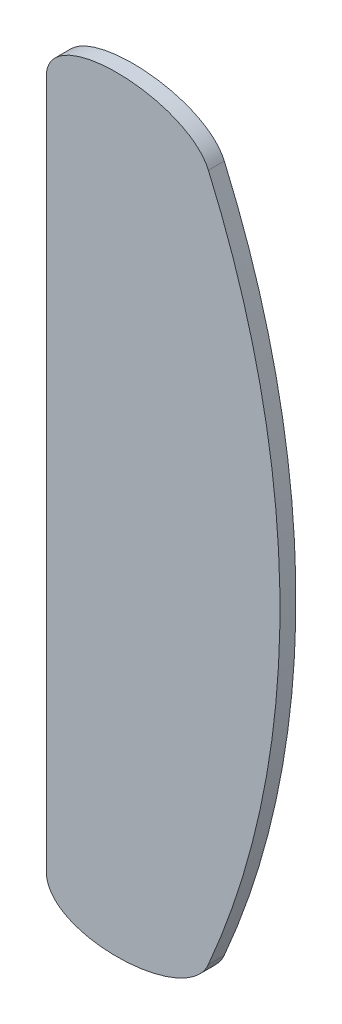
ISO-10303-21;
HEADER;
FILE_DESCRIPTION(('STEP AP214'),'2;1');
FILE_NAME('part.step','',(''),(''),'','','');
FILE_SCHEMA(('AUTOMOTIVE_DESIGN { 1 0 10303 214 1 1 1 1 }'));
ENDSEC;
DATA;
#1=APPLICATION_CONTEXT('core data for automotive mechanical design processes');
#2=APPLICATION_PROTOCOL_DEFINITION('international standard','automotive_design',2000,#1);
#3=PRODUCT_CONTEXT('',#1,'mechanical');
#4=PRODUCT('Part','Part','',(#3));
#5=PRODUCT_RELATED_PRODUCT_CATEGORY('part','',(#4));
#6=PRODUCT_DEFINITION_FORMATION('','',#4);
#7=PRODUCT_DEFINITION_CONTEXT('part definition',#1,'design');
#8=PRODUCT_DEFINITION('design','',#6,#7);
#9=PRODUCT_DEFINITION_SHAPE('','',#8);
#10=(LENGTH_UNIT() NAMED_UNIT(*) SI_UNIT(.MILLI.,.METRE.));
#11=(NAMED_UNIT(*) PLANE_ANGLE_UNIT() SI_UNIT($,.RADIAN.));
#12=(NAMED_UNIT(*) SI_UNIT($,.STERADIAN.) SOLID_ANGLE_UNIT());
#13=UNCERTAINTY_MEASURE_WITH_UNIT(LENGTH_MEASURE(1.E-05),#10,'distance_accuracy_value','');
#14=(GEOMETRIC_REPRESENTATION_CONTEXT(3) GLOBAL_UNCERTAINTY_ASSIGNED_CONTEXT((#13)) GLOBAL_UNIT_ASSIGNED_CONTEXT((#10,
#11,#12)) REPRESENTATION_CONTEXT('',''));
#15=CARTESIAN_POINT('',(0.,0.,0.));
#16=DIRECTION('',(0.,0.,1.));
#17=DIRECTION('',(1.,0.,0.));
#18=AXIS2_PLACEMENT_3D('',#15,#16,#17);
#19=CARTESIAN_POINT('',(3345.33171846151,1933.23089667076,19.05));
#20=CARTESIAN_POINT('',(3345.3317184615,1868.63205542242,19.05));
#21=CARTESIAN_POINT('',(3513.32436618912,1874.00952997675,19.05));
#22=CARTESIAN_POINT('',(3539.12824220654,1933.23089667075,19.05));
#23=B_SPLINE_CURVE_WITH_KNOTS('',3,(#19,#20,#21,#22),.UNSPECIFIED.,.F.,.F.,(4,4),(0.,
7.62978439941085),.UNSPECIFIED.);
#24=DIRECTION('',(0.,0.,-1.));
#25=VECTOR('',#24,1.);
#26=SURFACE_OF_LINEAR_EXTRUSION('',#23,#25);
#27=CARTESIAN_POINT('',(3345.33171846151,1933.23089667076,0.));
#28=CARTESIAN_POINT('',(3345.3317184615,1868.63205542242,0.));
#29=CARTESIAN_POINT('',(3513.32436618912,1874.00952997675,0.));
#30=CARTESIAN_POINT('',(3539.12824220654,1933.23089667075,0.));
#31=B_SPLINE_CURVE_WITH_KNOTS('',3,(#27,#28,#29,#30),.UNSPECIFIED.,.F.,.F.,(4,4),(0.,
7.62978439941085),.UNSPECIFIED.);
#32=CARTESIAN_POINT('',(3345.33171846151,1933.23089667076,0.));
#33=VERTEX_POINT('',#32);
#34=CARTESIAN_POINT('',(3539.12824220654,1933.23089667075,0.));
#35=VERTEX_POINT('',#34);
#36=EDGE_CURVE('E116',#33,#35,#31,.T.);
#37=ORIENTED_EDGE('',*,*,#36,.T.);
#38=DIRECTION('',(0.,0.,-1.));
#39=VECTOR('',#38,1.);
#40=CARTESIAN_POINT('',(3539.12824220654,1933.23089667075,19.05));
#41=LINE('',#40,#39);
#42=CARTESIAN_POINT('',(3539.12824220654,1933.23089667075,19.05));
#43=VERTEX_POINT('',#42);
#44=EDGE_CURVE('E11',#43,#35,#41,.T.);
#45=ORIENTED_EDGE('',*,*,#44,.F.);
#46=CARTESIAN_POINT('',(3345.33171846151,1933.23089667076,19.05));
#47=VERTEX_POINT('',#46);
#48=EDGE_CURVE('E85',#47,#43,#23,.T.);
#49=ORIENTED_EDGE('',*,*,#48,.F.);
#50=DIRECTION('',(0.,0.,-1.));
#51=VECTOR('',#50,1.);
#52=CARTESIAN_POINT('',(3345.33171846151,1933.23089667076,19.05));
#53=LINE('',#52,#51);
#54=EDGE_CURVE('E93',#47,#33,#53,.T.);
#55=ORIENTED_EDGE('',*,*,#54,.T.);
#56=EDGE_LOOP('',(#37,#45,#49,#55));
#57=FACE_BOUND('',#56,.T.);
#58=ADVANCED_FACE('F33',(#57),#26,.F.);
#59=CARTESIAN_POINT('',(2593.71663344863,2345.16471886488,19.05));
#60=DIRECTION('',(0.,0.,-1.));
#61=DIRECTION('',(-1.,0.,0.));
#62=AXIS2_PLACEMENT_3D('',#59,#60,#61);
#63=CYLINDRICAL_SURFACE('',#62,1031.25776789398);
#64=CARTESIAN_POINT('',(2593.71663344863,2345.16471886488,0.));
#65=DIRECTION('',(0.,0.,1.));
#66=DIRECTION('',(1.,0.,0.));
#67=AXIS2_PLACEMENT_3D('',#64,#65,#66);
#68=CIRCLE('',#67,1031.25776789398);
#69=CARTESIAN_POINT('',(3539.34440607643,2756.60207676602,0.));
#70=VERTEX_POINT('',#69);
#71=EDGE_CURVE('E89',#35,#70,#68,.T.);
#72=ORIENTED_EDGE('',*,*,#71,.T.);
#73=DIRECTION('',(0.,0.,-1.));
#74=VECTOR('',#73,1.);
#75=CARTESIAN_POINT('',(3539.34440607643,2756.60207676602,19.05));
#76=LINE('',#75,#74);
#77=CARTESIAN_POINT('',(3539.34440607643,2756.60207676602,19.05));
#78=VERTEX_POINT('',#77);
#79=EDGE_CURVE('E42',#78,#70,#76,.T.);
#80=ORIENTED_EDGE('',*,*,#79,.F.);
#81=CARTESIAN_POINT('',(2593.71663344863,2345.16471886488,19.05));
#82=DIRECTION('',(0.,0.,1.));
#83=DIRECTION('',(1.,0.,0.));
#84=AXIS2_PLACEMENT_3D('',#81,#82,#83);
#85=CIRCLE('',#84,1031.25776789398);
#86=EDGE_CURVE('E80',#43,#78,#85,.T.);
#87=ORIENTED_EDGE('',*,*,#86,.F.);
#88=ORIENTED_EDGE('',*,*,#44,.T.);
#89=EDGE_LOOP('',(#72,#80,#87,#88));
#90=FACE_BOUND('',#89,.T.);
#91=ADVANCED_FACE('F88',(#90),#63,.T.);
#92=CARTESIAN_POINT('',(3539.34440607643,2756.60207676602,19.05));
#93=CARTESIAN_POINT('',(3513.54288160901,2815.90305574612,19.05));
#94=CARTESIAN_POINT('',(3345.33171846151,2821.27297263766,19.05));
#95=CARTESIAN_POINT('',(3345.33171846151,2756.60207676602,19.05));
#96=B_SPLINE_CURVE_WITH_KNOTS('',3,(#92,#93,#94,#95),.UNSPECIFIED.,.F.,.F.,(4,4),(0.,
7.63829478798895),.UNSPECIFIED.);
#97=DIRECTION('',(0.,0.,-1.));
#98=VECTOR('',#97,1.);
#99=SURFACE_OF_LINEAR_EXTRUSION('',#96,#98);
#100=CARTESIAN_POINT('',(3539.34440607643,2756.60207676602,0.));
#101=CARTESIAN_POINT('',(3513.54288160901,2815.90305574612,0.));
#102=CARTESIAN_POINT('',(3345.33171846151,2821.27297263766,0.));
#103=CARTESIAN_POINT('',(3345.33171846151,2756.60207676602,0.));
#104=B_SPLINE_CURVE_WITH_KNOTS('',3,(#100,#101,#102,#103),.UNSPECIFIED.,.F.,.F.,(4,4),(0.,
7.63829478798895),.UNSPECIFIED.);
#105=CARTESIAN_POINT('',(3345.33171846151,2756.60207676602,0.));
#106=VERTEX_POINT('',#105);
#107=EDGE_CURVE('E67',#70,#106,#104,.T.);
#108=ORIENTED_EDGE('',*,*,#107,.T.);
#109=DIRECTION('',(0.,0.,-1.));
#110=VECTOR('',#109,1.);
#111=CARTESIAN_POINT('',(3345.33171846151,2756.60207676602,19.05));
#112=LINE('',#111,#110);
#113=CARTESIAN_POINT('',(3345.33171846151,2756.60207676602,19.05));
#114=VERTEX_POINT('',#113);
#115=EDGE_CURVE('E90',#114,#106,#112,.T.);
#116=ORIENTED_EDGE('',*,*,#115,.F.);
#117=EDGE_CURVE('E83',#78,#114,#96,.T.);
#118=ORIENTED_EDGE('',*,*,#117,.F.);
#119=ORIENTED_EDGE('',*,*,#79,.T.);
#120=EDGE_LOOP('',(#108,#116,#118,#119));
#121=FACE_BOUND('',#120,.T.);
#122=ADVANCED_FACE('F91',(#121),#99,.F.);
#123=CARTESIAN_POINT('',(3345.33171846151,2756.60207676602,19.05));
#124=DIRECTION('',(1.,0.,0.));
#125=DIRECTION('',(0.,1.,0.));
#126=AXIS2_PLACEMENT_3D('',#123,#124,#125);
#127=PLANE('',#126);
#128=DIRECTION('',(0.,-1.,0.));
#129=VECTOR('',#128,1.);
#130=CARTESIAN_POINT('',(3345.33171846151,2756.60207676602,0.));
#131=LINE('',#130,#129);
#132=EDGE_CURVE('E73',#106,#33,#131,.T.);
#133=ORIENTED_EDGE('',*,*,#132,.T.);
#134=ORIENTED_EDGE('',*,*,#54,.F.);
#135=DIRECTION('',(0.,-1.,0.));
#136=VECTOR('',#135,1.);
#137=CARTESIAN_POINT('',(3345.33171846151,2756.60207676602,19.05));
#138=LINE('',#137,#136);
#139=EDGE_CURVE('E50',#114,#47,#138,.T.);
#140=ORIENTED_EDGE('',*,*,#139,.F.);
#141=ORIENTED_EDGE('',*,*,#115,.T.);
#142=EDGE_LOOP('',(#133,#134,#140,#141));
#143=FACE_BOUND('',#142,.T.);
#144=ADVANCED_FACE('F105',(#143),#127,.F.);
#145=CARTESIAN_POINT('',(3432.55352682749,1886.79831869238,19.05));
#146=DIRECTION('',(0.,0.,1.));
#147=DIRECTION('',(1.,0.,0.));
#148=AXIS2_PLACEMENT_3D('',#145,#146,#147);
#149=PLANE('',#148);
#150=ORIENTED_EDGE('',*,*,#48,.T.);
#151=ORIENTED_EDGE('',*,*,#86,.T.);
#152=ORIENTED_EDGE('',*,*,#117,.T.);
#153=ORIENTED_EDGE('',*,*,#139,.T.);
#154=EDGE_LOOP('',(#150,#151,#152,#153));
#155=FACE_BOUND('',#154,.T.);
#156=ADVANCED_FACE('F81',(#155),#149,.T.);
#157=CARTESIAN_POINT('',(3432.55352682749,1886.79831869238,0.));
#158=DIRECTION('',(0.,0.,1.));
#159=DIRECTION('',(1.,0.,0.));
#160=AXIS2_PLACEMENT_3D('',#157,#158,#159);
#161=PLANE('',#160);
#162=ORIENTED_EDGE('',*,*,#36,.F.);
#163=ORIENTED_EDGE('',*,*,#132,.F.);
#164=ORIENTED_EDGE('',*,*,#107,.F.);
#165=ORIENTED_EDGE('',*,*,#71,.F.);
#166=EDGE_LOOP('',(#162,#163,#164,#165));
#167=FACE_BOUND('',#166,.T.);
#168=ADVANCED_FACE('F133',(#167),#161,.F.);
#169=CLOSED_SHELL('',(#58,#91,#122,#144,#156,#168));
#170=MANIFOLD_SOLID_BREP('B2',#169);
#171=ADVANCED_BREP_SHAPE_REPRESENTATION('',(#18,#170),#14);
#172=SHAPE_DEFINITION_REPRESENTATION(#9,#171);
ENDSEC;
END-ISO-10303-21;
